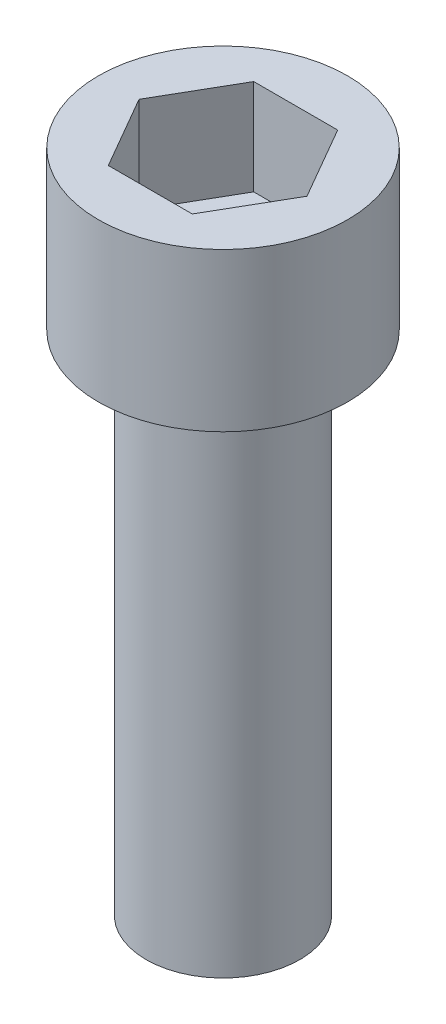
ISO-10303-21;
HEADER;
FILE_DESCRIPTION(('STEP AP214'),'2;1');
FILE_NAME('part.step','',(''),(''),'','','');
FILE_SCHEMA(('AUTOMOTIVE_DESIGN { 1 0 10303 214 1 1 1 1 }'));
ENDSEC;
DATA;
#1=APPLICATION_CONTEXT('core data for automotive mechanical design processes');
#2=APPLICATION_PROTOCOL_DEFINITION('international standard','automotive_design',2000,#1);
#3=PRODUCT_CONTEXT('',#1,'mechanical');
#4=PRODUCT('Part','Part','',(#3));
#5=PRODUCT_RELATED_PRODUCT_CATEGORY('part','',(#4));
#6=PRODUCT_DEFINITION_FORMATION('','',#4);
#7=PRODUCT_DEFINITION_CONTEXT('part definition',#1,'design');
#8=PRODUCT_DEFINITION('design','',#6,#7);
#9=PRODUCT_DEFINITION_SHAPE('','',#8);
#10=(LENGTH_UNIT() NAMED_UNIT(*) SI_UNIT(.MILLI.,.METRE.));
#11=(NAMED_UNIT(*) PLANE_ANGLE_UNIT() SI_UNIT($,.RADIAN.));
#12=(NAMED_UNIT(*) SI_UNIT($,.STERADIAN.) SOLID_ANGLE_UNIT());
#13=UNCERTAINTY_MEASURE_WITH_UNIT(LENGTH_MEASURE(1.E-05),#10,'distance_accuracy_value','');
#14=(GEOMETRIC_REPRESENTATION_CONTEXT(3) GLOBAL_UNCERTAINTY_ASSIGNED_CONTEXT((#13)) GLOBAL_UNIT_ASSIGNED_CONTEXT((#10,
#11,#12)) REPRESENTATION_CONTEXT('',''));
#15=CARTESIAN_POINT('',(0.,0.,0.));
#16=DIRECTION('',(0.,0.,1.));
#17=DIRECTION('',(1.,0.,0.));
#18=AXIS2_PLACEMENT_3D('',#15,#16,#17);
#19=CARTESIAN_POINT('',(0.,0.,0.));
#20=DIRECTION('',(0.,1.,0.));
#21=DIRECTION('',(0.,0.,1.));
#22=AXIS2_PLACEMENT_3D('',#19,#20,#21);
#23=PLANE('',#22);
#24=CARTESIAN_POINT('',(0.,0.,0.));
#25=DIRECTION('',(0.,1.,0.));
#26=DIRECTION('',(0.,0.,1.));
#27=AXIS2_PLACEMENT_3D('',#24,#25,#26);
#28=CIRCLE('',#27,2.3495);
#29=CARTESIAN_POINT('',(0.,0.,2.3495));
#30=VERTEX_POINT('',#29);
#31=EDGE_CURVE('E11',#30,#30,#28,.T.);
#32=ORIENTED_EDGE('',*,*,#31,.F.);
#33=EDGE_LOOP('',(#32));
#34=FACE_BOUND('',#33,.T.);
#35=ADVANCED_FACE('F33',(#34),#23,.F.);
#36=CARTESIAN_POINT('',(0.,20.32,0.));
#37=DIRECTION('',(0.,1.,0.));
#38=DIRECTION('',(0.,0.,1.));
#39=AXIS2_PLACEMENT_3D('',#36,#37,#38);
#40=CYLINDRICAL_SURFACE('',#39,2.3495);
#41=CARTESIAN_POINT('',(0.,15.494,0.));
#42=DIRECTION('',(0.,1.,0.));
#43=DIRECTION('',(0.,0.,1.));
#44=AXIS2_PLACEMENT_3D('',#41,#42,#43);
#45=CIRCLE('',#44,2.3495);
#46=CARTESIAN_POINT('',(0.,15.494,2.3495));
#47=VERTEX_POINT('',#46);
#48=EDGE_CURVE('E40',#47,#47,#45,.T.);
#49=ORIENTED_EDGE('',*,*,#48,.F.);
#50=EDGE_LOOP('',(#49));
#51=FACE_BOUND('',#50,.T.);
#52=ORIENTED_EDGE('',*,*,#31,.T.);
#53=EDGE_LOOP('',(#52));
#54=FACE_BOUND('',#53,.T.);
#55=ADVANCED_FACE('F149',(#51,#54),#40,.T.);
#56=CARTESIAN_POINT('',(0.,15.494,-2.3495));
#57=DIRECTION('',(0.,1.,0.));
#58=DIRECTION('',(0.,0.,1.));
#59=AXIS2_PLACEMENT_3D('',#56,#57,#58);
#60=PLANE('',#59);
#61=CARTESIAN_POINT('',(0.,15.494,0.));
#62=DIRECTION('',(0.,1.,0.));
#63=DIRECTION('',(0.,0.,1.));
#64=AXIS2_PLACEMENT_3D('',#61,#62,#63);
#65=CIRCLE('',#64,3.81);
#66=CARTESIAN_POINT('',(0.,15.494,3.81));
#67=VERTEX_POINT('',#66);
#68=EDGE_CURVE('E142',#67,#67,#65,.T.);
#69=ORIENTED_EDGE('',*,*,#68,.F.);
#70=EDGE_LOOP('',(#69));
#71=FACE_BOUND('',#70,.T.);
#72=ORIENTED_EDGE('',*,*,#48,.T.);
#73=EDGE_LOOP('',(#72));
#74=FACE_BOUND('',#73,.T.);
#75=ADVANCED_FACE('F147',(#71,#74),#60,.F.);
#76=CARTESIAN_POINT('',(0.,20.32,0.));
#77=DIRECTION('',(0.,1.,0.));
#78=DIRECTION('',(0.,0.,1.));
#79=AXIS2_PLACEMENT_3D('',#76,#77,#78);
#80=CYLINDRICAL_SURFACE('',#79,3.81);
#81=CARTESIAN_POINT('',(0.,20.32,0.));
#82=DIRECTION('',(0.,1.,0.));
#83=DIRECTION('',(0.,0.,1.));
#84=AXIS2_PLACEMENT_3D('',#81,#82,#83);
#85=CIRCLE('',#84,3.81);
#86=CARTESIAN_POINT('',(0.,20.32,3.81));
#87=VERTEX_POINT('',#86);
#88=EDGE_CURVE('E134',#87,#87,#85,.T.);
#89=ORIENTED_EDGE('',*,*,#88,.F.);
#90=EDGE_LOOP('',(#89));
#91=FACE_BOUND('',#90,.T.);
#92=ORIENTED_EDGE('',*,*,#68,.T.);
#93=EDGE_LOOP('',(#92));
#94=FACE_BOUND('',#93,.T.);
#95=ADVANCED_FACE('F167',(#91,#94),#80,.T.);
#96=CARTESIAN_POINT('',(0.,20.32,-3.81));
#97=DIRECTION('',(0.,-1.,0.));
#98=DIRECTION('',(0.,0.,-1.));
#99=AXIS2_PLACEMENT_3D('',#96,#97,#98);
#100=PLANE('',#99);
#101=DIRECTION('',(0.5,0.,-0.866025403784439));
#102=VECTOR('',#101,1.);
#103=CARTESIAN_POINT('',(1.28316097327394,20.32,2.2225));
#104=LINE('',#103,#102);
#105=CARTESIAN_POINT('',(1.28316097327394,20.32,2.2225));
#106=VERTEX_POINT('',#105);
#107=CARTESIAN_POINT('',(2.56632194654789,20.32,0.));
#108=VERTEX_POINT('',#107);
#109=EDGE_CURVE('E121',#106,#108,#104,.T.);
#110=ORIENTED_EDGE('',*,*,#109,.F.);
#111=DIRECTION('',(1.,0.,0.));
#112=VECTOR('',#111,1.);
#113=CARTESIAN_POINT('',(-1.28316097327394,20.32,2.2225));
#114=LINE('',#113,#112);
#115=CARTESIAN_POINT('',(-1.28316097327394,20.32,2.2225));
#116=VERTEX_POINT('',#115);
#117=EDGE_CURVE('E47',#116,#106,#114,.T.);
#118=ORIENTED_EDGE('',*,*,#117,.F.);
#119=DIRECTION('',(0.5,0.,0.866025403784439));
#120=VECTOR('',#119,1.);
#121=CARTESIAN_POINT('',(-2.56632194654789,20.32,0.));
#122=LINE('',#121,#120);
#123=CARTESIAN_POINT('',(-2.56632194654789,20.32,0.));
#124=VERTEX_POINT('',#123);
#125=EDGE_CURVE('E130',#124,#116,#122,.T.);
#126=ORIENTED_EDGE('',*,*,#125,.F.);
#127=DIRECTION('',(-0.5,0.,0.866025403784439));
#128=VECTOR('',#127,1.);
#129=CARTESIAN_POINT('',(-1.28316097327394,20.32,-2.2225));
#130=LINE('',#129,#128);
#131=CARTESIAN_POINT('',(-1.28316097327394,20.32,-2.2225));
#132=VERTEX_POINT('',#131);
#133=EDGE_CURVE('E128',#132,#124,#130,.T.);
#134=ORIENTED_EDGE('',*,*,#133,.F.);
#135=DIRECTION('',(-1.,0.,0.));
#136=VECTOR('',#135,1.);
#137=CARTESIAN_POINT('',(1.28316097327394,20.32,-2.2225));
#138=LINE('',#137,#136);
#139=CARTESIAN_POINT('',(1.28316097327394,20.32,-2.2225));
#140=VERTEX_POINT('',#139);
#141=EDGE_CURVE('E95',#140,#132,#138,.T.);
#142=ORIENTED_EDGE('',*,*,#141,.F.);
#143=DIRECTION('',(-0.5,0.,-0.866025403784438));
#144=VECTOR('',#143,1.);
#145=CARTESIAN_POINT('',(2.56632194654789,20.32,0.));
#146=LINE('',#145,#144);
#147=EDGE_CURVE('E124',#108,#140,#146,.T.);
#148=ORIENTED_EDGE('',*,*,#147,.F.);
#149=EDGE_LOOP('',(#110,#118,#126,#134,#142,#148));
#150=FACE_BOUND('',#149,.T.);
#151=ORIENTED_EDGE('',*,*,#88,.T.);
#152=EDGE_LOOP('',(#151));
#153=FACE_BOUND('',#152,.T.);
#154=ADVANCED_FACE('F175',(#150,#153),#100,.F.);
#155=CARTESIAN_POINT('',(-1.28316097327394,17.399,2.2225));
#156=DIRECTION('',(0.,0.,1.));
#157=DIRECTION('',(0.,-1.,0.));
#158=AXIS2_PLACEMENT_3D('',#155,#156,#157);
#159=PLANE('',#158);
#160=ORIENTED_EDGE('',*,*,#117,.T.);
#161=DIRECTION('',(0.,1.,0.));
#162=VECTOR('',#161,1.);
#163=CARTESIAN_POINT('',(1.28316097327394,17.399,2.2225));
#164=LINE('',#163,#162);
#165=CARTESIAN_POINT('',(1.28316097327394,17.399,2.2225));
#166=VERTEX_POINT('',#165);
#167=EDGE_CURVE('E77',#166,#106,#164,.T.);
#168=ORIENTED_EDGE('',*,*,#167,.F.);
#169=DIRECTION('',(1.,0.,0.));
#170=VECTOR('',#169,1.);
#171=CARTESIAN_POINT('',(-1.28316097327394,17.399,2.2225));
#172=LINE('',#171,#170);
#173=CARTESIAN_POINT('',(-1.28316097327394,17.399,2.2225));
#174=VERTEX_POINT('',#173);
#175=EDGE_CURVE('E132',#174,#166,#172,.T.);
#176=ORIENTED_EDGE('',*,*,#175,.F.);
#177=DIRECTION('',(0.,1.,0.));
#178=VECTOR('',#177,1.);
#179=CARTESIAN_POINT('',(-1.28316097327394,17.399,2.2225));
#180=LINE('',#179,#178);
#181=EDGE_CURVE('E55',#174,#116,#180,.T.);
#182=ORIENTED_EDGE('',*,*,#181,.T.);
#183=EDGE_LOOP('',(#160,#168,#176,#182));
#184=FACE_BOUND('',#183,.T.);
#185=ADVANCED_FACE('F183',(#184),#159,.F.);
#186=CARTESIAN_POINT('',(-2.56632194654789,17.399,0.));
#187=DIRECTION('',(-0.866025403784439,0.,0.5));
#188=DIRECTION('',(0.5,0.,0.866025403784439));
#189=AXIS2_PLACEMENT_3D('',#186,#187,#188);
#190=PLANE('',#189);
#191=ORIENTED_EDGE('',*,*,#125,.T.);
#192=ORIENTED_EDGE('',*,*,#181,.F.);
#193=DIRECTION('',(0.5,0.,0.866025403784439));
#194=VECTOR('',#193,1.);
#195=CARTESIAN_POINT('',(-2.56632194654789,17.399,0.));
#196=LINE('',#195,#194);
#197=CARTESIAN_POINT('',(-2.56632194654789,17.399,0.));
#198=VERTEX_POINT('',#197);
#199=EDGE_CURVE('E107',#198,#174,#196,.T.);
#200=ORIENTED_EDGE('',*,*,#199,.F.);
#201=DIRECTION('',(0.,1.,0.));
#202=VECTOR('',#201,1.);
#203=CARTESIAN_POINT('',(-2.56632194654789,17.399,0.));
#204=LINE('',#203,#202);
#205=EDGE_CURVE('E99',#198,#124,#204,.T.);
#206=ORIENTED_EDGE('',*,*,#205,.T.);
#207=EDGE_LOOP('',(#191,#192,#200,#206));
#208=FACE_BOUND('',#207,.T.);
#209=ADVANCED_FACE('F191',(#208),#190,.F.);
#210=CARTESIAN_POINT('',(-1.28316097327394,17.399,-2.2225));
#211=DIRECTION('',(-0.866025403784439,0.,-0.5));
#212=DIRECTION('',(-0.5,0.,0.866025403784439));
#213=AXIS2_PLACEMENT_3D('',#210,#211,#212);
#214=PLANE('',#213);
#215=ORIENTED_EDGE('',*,*,#133,.T.);
#216=ORIENTED_EDGE('',*,*,#205,.F.);
#217=DIRECTION('',(-0.5,0.,0.866025403784439));
#218=VECTOR('',#217,1.);
#219=CARTESIAN_POINT('',(-1.28316097327394,17.399,-2.2225));
#220=LINE('',#219,#218);
#221=CARTESIAN_POINT('',(-1.28316097327394,17.399,-2.2225));
#222=VERTEX_POINT('',#221);
#223=EDGE_CURVE('E103',#222,#198,#220,.T.);
#224=ORIENTED_EDGE('',*,*,#223,.F.);
#225=DIRECTION('',(0.,1.,0.));
#226=VECTOR('',#225,1.);
#227=CARTESIAN_POINT('',(-1.28316097327394,17.399,-2.2225));
#228=LINE('',#227,#226);
#229=EDGE_CURVE('E88',#222,#132,#228,.T.);
#230=ORIENTED_EDGE('',*,*,#229,.T.);
#231=EDGE_LOOP('',(#215,#216,#224,#230));
#232=FACE_BOUND('',#231,.T.);
#233=ADVANCED_FACE('F104',(#232),#214,.F.);
#234=CARTESIAN_POINT('',(1.28316097327394,17.399,-2.2225));
#235=DIRECTION('',(0.,0.,-1.));
#236=DIRECTION('',(0.,1.,0.));
#237=AXIS2_PLACEMENT_3D('',#234,#235,#236);
#238=PLANE('',#237);
#239=ORIENTED_EDGE('',*,*,#141,.T.);
#240=ORIENTED_EDGE('',*,*,#229,.F.);
#241=DIRECTION('',(-1.,0.,0.));
#242=VECTOR('',#241,1.);
#243=CARTESIAN_POINT('',(1.28316097327394,17.399,-2.2225));
#244=LINE('',#243,#242);
#245=CARTESIAN_POINT('',(1.28316097327394,17.399,-2.2225));
#246=VERTEX_POINT('',#245);
#247=EDGE_CURVE('E92',#246,#222,#244,.T.);
#248=ORIENTED_EDGE('',*,*,#247,.F.);
#249=DIRECTION('',(0.,1.,0.));
#250=VECTOR('',#249,1.);
#251=CARTESIAN_POINT('',(1.28316097327394,17.399,-2.2225));
#252=LINE('',#251,#250);
#253=EDGE_CURVE('E100',#246,#140,#252,.T.);
#254=ORIENTED_EDGE('',*,*,#253,.T.);
#255=EDGE_LOOP('',(#239,#240,#248,#254));
#256=FACE_BOUND('',#255,.T.);
#257=ADVANCED_FACE('F90',(#256),#238,.F.);
#258=CARTESIAN_POINT('',(2.56632194654789,17.399,0.));
#259=DIRECTION('',(0.866025403784439,0.,-0.5));
#260=DIRECTION('',(-0.5,0.,-0.866025403784439));
#261=AXIS2_PLACEMENT_3D('',#258,#259,#260);
#262=PLANE('',#261);
#263=ORIENTED_EDGE('',*,*,#147,.T.);
#264=ORIENTED_EDGE('',*,*,#253,.F.);
#265=DIRECTION('',(-0.5,0.,-0.866025403784438));
#266=VECTOR('',#265,1.);
#267=CARTESIAN_POINT('',(2.56632194654789,17.399,0.));
#268=LINE('',#267,#266);
#269=CARTESIAN_POINT('',(2.56632194654789,17.399,0.));
#270=VERTEX_POINT('',#269);
#271=EDGE_CURVE('E113',#270,#246,#268,.T.);
#272=ORIENTED_EDGE('',*,*,#271,.F.);
#273=DIRECTION('',(0.,1.,0.));
#274=VECTOR('',#273,1.);
#275=CARTESIAN_POINT('',(2.56632194654789,17.399,0.));
#276=LINE('',#275,#274);
#277=EDGE_CURVE('E137',#270,#108,#276,.T.);
#278=ORIENTED_EDGE('',*,*,#277,.T.);
#279=EDGE_LOOP('',(#263,#264,#272,#278));
#280=FACE_BOUND('',#279,.T.);
#281=ADVANCED_FACE('F210',(#280),#262,.F.);
#282=CARTESIAN_POINT('',(1.28316097327394,17.399,2.2225));
#283=DIRECTION('',(0.866025403784439,0.,0.5));
#284=DIRECTION('',(0.5,0.,-0.866025403784439));
#285=AXIS2_PLACEMENT_3D('',#282,#283,#284);
#286=PLANE('',#285);
#287=ORIENTED_EDGE('',*,*,#109,.T.);
#288=ORIENTED_EDGE('',*,*,#277,.F.);
#289=DIRECTION('',(0.5,0.,-0.866025403784439));
#290=VECTOR('',#289,1.);
#291=CARTESIAN_POINT('',(1.28316097327394,17.399,2.2225));
#292=LINE('',#291,#290);
#293=EDGE_CURVE('E115',#166,#270,#292,.T.);
#294=ORIENTED_EDGE('',*,*,#293,.F.);
#295=ORIENTED_EDGE('',*,*,#167,.T.);
#296=EDGE_LOOP('',(#287,#288,#294,#295));
#297=FACE_BOUND('',#296,.T.);
#298=ADVANCED_FACE('F217',(#297),#286,.F.);
#299=CARTESIAN_POINT('',(1.28316097327394,17.399,2.2225));
#300=DIRECTION('',(0.,1.,0.));
#301=DIRECTION('',(0.,0.,1.));
#302=AXIS2_PLACEMENT_3D('',#299,#300,#301);
#303=PLANE('',#302);
#304=ORIENTED_EDGE('',*,*,#175,.T.);
#305=ORIENTED_EDGE('',*,*,#293,.T.);
#306=ORIENTED_EDGE('',*,*,#271,.T.);
#307=ORIENTED_EDGE('',*,*,#247,.T.);
#308=ORIENTED_EDGE('',*,*,#223,.T.);
#309=ORIENTED_EDGE('',*,*,#199,.T.);
#310=EDGE_LOOP('',(#304,#305,#306,#307,#308,#309));
#311=FACE_BOUND('',#310,.T.);
#312=ADVANCED_FACE('F110',(#311),#303,.T.);
#313=CLOSED_SHELL('',(#35,#55,#75,#95,#154,#185,#209,#233,#257,#281,#298,#312));
#314=MANIFOLD_SOLID_BREP('B2',#313);
#315=ADVANCED_BREP_SHAPE_REPRESENTATION('',(#18,#314),#14);
#316=SHAPE_DEFINITION_REPRESENTATION(#9,#315);
ENDSEC;
END-ISO-10303-21;
